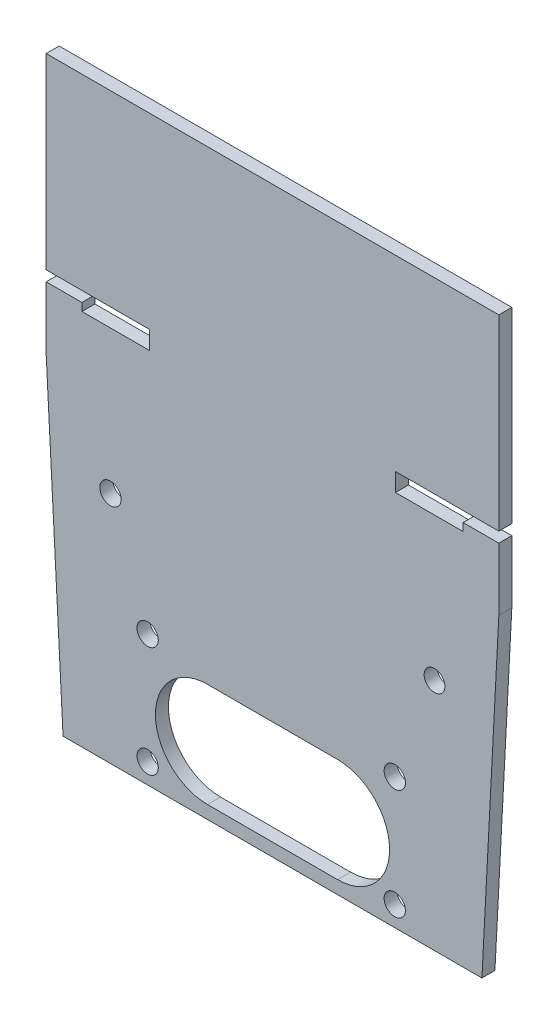
ISO-10303-21;
HEADER;
FILE_DESCRIPTION(('STEP AP214'),'2;1');
FILE_NAME('part.step','',(''),(''),'','','');
FILE_SCHEMA(('AUTOMOTIVE_DESIGN { 1 0 10303 214 1 1 1 1 }'));
ENDSEC;
DATA;
#1=APPLICATION_CONTEXT('core data for automotive mechanical design processes');
#2=APPLICATION_PROTOCOL_DEFINITION('international standard','automotive_design',2000,#1);
#3=PRODUCT_CONTEXT('',#1,'mechanical');
#4=PRODUCT('Part','Part','',(#3));
#5=PRODUCT_RELATED_PRODUCT_CATEGORY('part','',(#4));
#6=PRODUCT_DEFINITION_FORMATION('','',#4);
#7=PRODUCT_DEFINITION_CONTEXT('part definition',#1,'design');
#8=PRODUCT_DEFINITION('design','',#6,#7);
#9=PRODUCT_DEFINITION_SHAPE('','',#8);
#10=(LENGTH_UNIT() NAMED_UNIT(*) SI_UNIT(.MILLI.,.METRE.));
#11=(NAMED_UNIT(*) PLANE_ANGLE_UNIT() SI_UNIT($,.RADIAN.));
#12=(NAMED_UNIT(*) SI_UNIT($,.STERADIAN.) SOLID_ANGLE_UNIT());
#13=UNCERTAINTY_MEASURE_WITH_UNIT(LENGTH_MEASURE(1.E-05),#10,'distance_accuracy_value','');
#14=(GEOMETRIC_REPRESENTATION_CONTEXT(3) GLOBAL_UNCERTAINTY_ASSIGNED_CONTEXT((#13)) GLOBAL_UNIT_ASSIGNED_CONTEXT((#10,
#11,#12)) REPRESENTATION_CONTEXT('',''));
#15=CARTESIAN_POINT('',(0.,0.,0.));
#16=DIRECTION('',(0.,0.,1.));
#17=DIRECTION('',(1.,0.,0.));
#18=AXIS2_PLACEMENT_3D('',#15,#16,#17);
#19=CARTESIAN_POINT('',(-47.2577867027928,0.,5.));
#20=DIRECTION('',(1.,0.,0.));
#21=DIRECTION('',(0.,1.,0.));
#22=AXIS2_PLACEMENT_3D('',#19,#20,#21);
#23=PLANE('',#22);
#24=DIRECTION('',(0.,0.,-1.));
#25=VECTOR('',#24,1.);
#26=CARTESIAN_POINT('',(-47.2577867027929,82.9999999999999,5.));
#27=LINE('',#26,#25);
#28=CARTESIAN_POINT('',(-47.2577867027929,82.9999999999999,5.));
#29=VERTEX_POINT('',#28);
#30=CARTESIAN_POINT('',(-47.2577867027929,82.9999999999999,0.));
#31=VERTEX_POINT('',#30);
#32=EDGE_CURVE('E265',#29,#31,#27,.T.);
#33=ORIENTED_EDGE('',*,*,#32,.F.);
#34=DIRECTION('',(0.,-1.,0.));
#35=VECTOR('',#34,1.);
#36=CARTESIAN_POINT('',(-47.2577867027928,0.,5.));
#37=LINE('',#36,#35);
#38=CARTESIAN_POINT('',(-47.2577867027929,90.,5.));
#39=VERTEX_POINT('',#38);
#40=EDGE_CURVE('E188',#39,#29,#37,.T.);
#41=ORIENTED_EDGE('',*,*,#40,.F.);
#42=DIRECTION('',(0.,0.,-1.));
#43=VECTOR('',#42,1.);
#44=CARTESIAN_POINT('',(-47.2577867027929,90.,5.));
#45=LINE('',#44,#43);
#46=CARTESIAN_POINT('',(-47.2577867027929,90.,0.));
#47=VERTEX_POINT('',#46);
#48=EDGE_CURVE('E267',#39,#47,#45,.T.);
#49=ORIENTED_EDGE('',*,*,#48,.T.);
#50=DIRECTION('',(0.,-1.,0.));
#51=VECTOR('',#50,1.);
#52=CARTESIAN_POINT('',(-47.2577867027928,0.,0.));
#53=LINE('',#52,#51);
#54=EDGE_CURVE('E253',#47,#31,#53,.T.);
#55=ORIENTED_EDGE('',*,*,#54,.T.);
#56=EDGE_LOOP('',(#33,#41,#49,#55));
#57=FACE_BOUND('',#56,.T.);
#58=ADVANCED_FACE('F37',(#57),#23,.F.);
#59=CARTESIAN_POINT('',(-73.2577867027929,0.,5.));
#60=DIRECTION('',(-1.,0.,0.));
#61=DIRECTION('',(0.,0.,1.));
#62=AXIS2_PLACEMENT_3D('',#59,#60,#61);
#63=PLANE('',#62);
#64=DIRECTION('',(0.,1.,0.));
#65=VECTOR('',#64,1.);
#66=CARTESIAN_POINT('',(-73.2577867027929,0.,5.));
#67=LINE('',#66,#65);
#68=CARTESIAN_POINT('',(-73.2577867027929,82.9999999999999,5.));
#69=VERTEX_POINT('',#68);
#70=CARTESIAN_POINT('',(-73.2577867027929,86.,5.));
#71=VERTEX_POINT('',#70);
#72=EDGE_CURVE('E175',#69,#71,#67,.T.);
#73=ORIENTED_EDGE('',*,*,#72,.F.);
#74=DIRECTION('',(0.,0.,-1.));
#75=VECTOR('',#74,1.);
#76=CARTESIAN_POINT('',(-73.2577867027929,82.9999999999999,5.));
#77=LINE('',#76,#75);
#78=CARTESIAN_POINT('',(-73.2577867027929,82.9999999999999,0.));
#79=VERTEX_POINT('',#78);
#80=EDGE_CURVE('E197',#69,#79,#77,.T.);
#81=ORIENTED_EDGE('',*,*,#80,.T.);
#82=DIRECTION('',(0.,1.,0.));
#83=VECTOR('',#82,1.);
#84=CARTESIAN_POINT('',(-73.2577867027929,0.,0.));
#85=LINE('',#84,#83);
#86=CARTESIAN_POINT('',(-73.2577867027929,86.,0.));
#87=VERTEX_POINT('',#86);
#88=EDGE_CURVE('E194',#79,#87,#85,.T.);
#89=ORIENTED_EDGE('',*,*,#88,.T.);
#90=DIRECTION('',(0.,0.,-1.));
#91=VECTOR('',#90,1.);
#92=CARTESIAN_POINT('',(-73.2577867027929,86.,5.));
#93=LINE('',#92,#91);
#94=EDGE_CURVE('E191',#71,#87,#93,.T.);
#95=ORIENTED_EDGE('',*,*,#94,.F.);
#96=EDGE_LOOP('',(#73,#81,#89,#95));
#97=FACE_BOUND('',#96,.T.);
#98=ADVANCED_FACE('F192',(#97),#63,.F.);
#99=CARTESIAN_POINT('',(-83.5213200872231,-4.37716690855885,5.));
#100=DIRECTION('',(0.998629534754574,0.052335956242937,0.));
#101=DIRECTION('',(-0.052335956242937,0.998629534754574,0.));
#102=AXIS2_PLACEMENT_3D('',#99,#100,#101);
#103=PLANE('',#102);
#104=DIRECTION('',(0.052335956242937,-0.998629534754574,0.));
#105=VECTOR('',#104,1.);
#106=CARTESIAN_POINT('',(-83.5213200872231,-4.37716690855885,0.));
#107=LINE('',#106,#105);
#108=CARTESIAN_POINT('',(-87.,62.,0.));
#109=VERTEX_POINT('',#108);
#110=CARTESIAN_POINT('',(-80.5014353689038,-62.,0.));
#111=VERTEX_POINT('',#110);
#112=EDGE_CURVE('E220',#109,#111,#107,.T.);
#113=ORIENTED_EDGE('',*,*,#112,.T.);
#114=DIRECTION('',(0.,0.,-1.));
#115=VECTOR('',#114,1.);
#116=CARTESIAN_POINT('',(-80.5014353689038,-62.,5.));
#117=LINE('',#116,#115);
#118=CARTESIAN_POINT('',(-80.5014353689038,-62.,5.));
#119=VERTEX_POINT('',#118);
#120=EDGE_CURVE('E11',#119,#111,#117,.T.);
#121=ORIENTED_EDGE('',*,*,#120,.F.);
#122=DIRECTION('',(0.052335956242937,-0.998629534754574,0.));
#123=VECTOR('',#122,1.);
#124=CARTESIAN_POINT('',(-83.5213200872231,-4.37716690855885,5.));
#125=LINE('',#124,#123);
#126=CARTESIAN_POINT('',(-87.,62.,5.));
#127=VERTEX_POINT('',#126);
#128=EDGE_CURVE('E322',#127,#119,#125,.T.);
#129=ORIENTED_EDGE('',*,*,#128,.F.);
#130=DIRECTION('',(0.,0.,-1.));
#131=VECTOR('',#130,1.);
#132=CARTESIAN_POINT('',(-87.,62.,5.));
#133=LINE('',#132,#131);
#134=EDGE_CURVE('E56',#127,#109,#133,.T.);
#135=ORIENTED_EDGE('',*,*,#134,.T.);
#136=EDGE_LOOP('',(#113,#121,#129,#135));
#137=FACE_BOUND('',#136,.T.);
#138=ADVANCED_FACE('F458',(#137),#103,.F.);
#139=CARTESIAN_POINT('',(0.,-62.,5.));
#140=DIRECTION('',(0.,1.,0.));
#141=DIRECTION('',(-1.,0.,0.));
#142=AXIS2_PLACEMENT_3D('',#139,#140,#141);
#143=PLANE('',#142);
#144=DIRECTION('',(1.,0.,0.));
#145=VECTOR('',#144,1.);
#146=CARTESIAN_POINT('',(0.,-62.,0.));
#147=LINE('',#146,#145);
#148=CARTESIAN_POINT('',(80.5014353689037,-62.,0.));
#149=VERTEX_POINT('',#148);
#150=EDGE_CURVE('E222',#111,#149,#147,.T.);
#151=ORIENTED_EDGE('',*,*,#150,.T.);
#152=DIRECTION('',(0.,0.,-1.));
#153=VECTOR('',#152,1.);
#154=CARTESIAN_POINT('',(80.5014353689037,-62.,5.));
#155=LINE('',#154,#153);
#156=CARTESIAN_POINT('',(80.5014353689037,-62.,5.));
#157=VERTEX_POINT('',#156);
#158=EDGE_CURVE('E47',#157,#149,#155,.T.);
#159=ORIENTED_EDGE('',*,*,#158,.F.);
#160=DIRECTION('',(1.,0.,0.));
#161=VECTOR('',#160,1.);
#162=CARTESIAN_POINT('',(0.,-62.,5.));
#163=LINE('',#162,#161);
#164=EDGE_CURVE('E325',#119,#157,#163,.T.);
#165=ORIENTED_EDGE('',*,*,#164,.F.);
#166=ORIENTED_EDGE('',*,*,#120,.T.);
#167=EDGE_LOOP('',(#151,#159,#165,#166));
#168=FACE_BOUND('',#167,.T.);
#169=ADVANCED_FACE('F493',(#168),#143,.F.);
#170=CARTESIAN_POINT('',(83.5213200872231,-4.37716690855885,5.));
#171=DIRECTION('',(0.998629534754574,-0.052335956242937,0.));
#172=DIRECTION('',(0.052335956242937,0.998629534754574,0.));
#173=AXIS2_PLACEMENT_3D('',#170,#171,#172);
#174=PLANE('',#173);
#175=DIRECTION('',(-0.052335956242937,-0.998629534754574,0.));
#176=VECTOR('',#175,1.);
#177=CARTESIAN_POINT('',(83.5213200872231,-4.37716690855885,0.));
#178=LINE('',#177,#176);
#179=CARTESIAN_POINT('',(87.,62.,0.));
#180=VERTEX_POINT('',#179);
#181=EDGE_CURVE('E225',#180,#149,#178,.T.);
#182=ORIENTED_EDGE('',*,*,#181,.F.);
#183=DIRECTION('',(0.,0.,-1.));
#184=VECTOR('',#183,1.);
#185=CARTESIAN_POINT('',(87.,62.,5.));
#186=LINE('',#185,#184);
#187=CARTESIAN_POINT('',(87.,62.,5.));
#188=VERTEX_POINT('',#187);
#189=EDGE_CURVE('E284',#188,#180,#186,.T.);
#190=ORIENTED_EDGE('',*,*,#189,.F.);
#191=DIRECTION('',(-0.052335956242937,-0.998629534754574,0.));
#192=VECTOR('',#191,1.);
#193=CARTESIAN_POINT('',(83.5213200872231,-4.37716690855885,5.));
#194=LINE('',#193,#192);
#195=EDGE_CURVE('E327',#188,#157,#194,.T.);
#196=ORIENTED_EDGE('',*,*,#195,.T.);
#197=ORIENTED_EDGE('',*,*,#158,.T.);
#198=EDGE_LOOP('',(#182,#190,#196,#197));
#199=FACE_BOUND('',#198,.T.);
#200=ADVANCED_FACE('F490',(#199),#174,.T.);
#201=CARTESIAN_POINT('',(87.,0.,5.));
#202=DIRECTION('',(1.,0.,0.));
#203=DIRECTION('',(0.,0.,-1.));
#204=AXIS2_PLACEMENT_3D('',#201,#202,#203);
#205=PLANE('',#204);
#206=DIRECTION('',(0.,-1.,0.));
#207=VECTOR('',#206,1.);
#208=CARTESIAN_POINT('',(87.,0.,0.));
#209=LINE('',#208,#207);
#210=CARTESIAN_POINT('',(87.,86.,0.));
#211=VERTEX_POINT('',#210);
#212=EDGE_CURVE('E228',#211,#180,#209,.T.);
#213=ORIENTED_EDGE('',*,*,#212,.F.);
#214=DIRECTION('',(0.,0.,-1.));
#215=VECTOR('',#214,1.);
#216=CARTESIAN_POINT('',(87.,86.,5.));
#217=LINE('',#216,#215);
#218=CARTESIAN_POINT('',(87.,86.,5.));
#219=VERTEX_POINT('',#218);
#220=EDGE_CURVE('E282',#219,#211,#217,.T.);
#221=ORIENTED_EDGE('',*,*,#220,.F.);
#222=DIRECTION('',(0.,-1.,0.));
#223=VECTOR('',#222,1.);
#224=CARTESIAN_POINT('',(87.,0.,5.));
#225=LINE('',#224,#223);
#226=EDGE_CURVE('E330',#219,#188,#225,.T.);
#227=ORIENTED_EDGE('',*,*,#226,.T.);
#228=ORIENTED_EDGE('',*,*,#189,.T.);
#229=EDGE_LOOP('',(#213,#221,#227,#228));
#230=FACE_BOUND('',#229,.T.);
#231=ADVANCED_FACE('F470',(#230),#205,.T.);
#232=CARTESIAN_POINT('',(0.,86.,5.));
#233=DIRECTION('',(0.,1.,0.));
#234=DIRECTION('',(0.,0.,1.));
#235=AXIS2_PLACEMENT_3D('',#232,#233,#234);
#236=PLANE('',#235);
#237=DIRECTION('',(1.,0.,0.));
#238=VECTOR('',#237,1.);
#239=CARTESIAN_POINT('',(0.,86.,0.));
#240=LINE('',#239,#238);
#241=CARTESIAN_POINT('',(73.2577867027928,86.,0.));
#242=VERTEX_POINT('',#241);
#243=EDGE_CURVE('E231',#242,#211,#240,.T.);
#244=ORIENTED_EDGE('',*,*,#243,.F.);
#245=DIRECTION('',(0.,0.,-1.));
#246=VECTOR('',#245,1.);
#247=CARTESIAN_POINT('',(73.2577867027928,86.,5.));
#248=LINE('',#247,#246);
#249=CARTESIAN_POINT('',(73.2577867027928,86.,5.));
#250=VERTEX_POINT('',#249);
#251=EDGE_CURVE('E280',#250,#242,#248,.T.);
#252=ORIENTED_EDGE('',*,*,#251,.F.);
#253=DIRECTION('',(1.,0.,0.));
#254=VECTOR('',#253,1.);
#255=CARTESIAN_POINT('',(0.,86.,5.));
#256=LINE('',#255,#254);
#257=EDGE_CURVE('E333',#250,#219,#256,.T.);
#258=ORIENTED_EDGE('',*,*,#257,.T.);
#259=ORIENTED_EDGE('',*,*,#220,.T.);
#260=EDGE_LOOP('',(#244,#252,#258,#259));
#261=FACE_BOUND('',#260,.T.);
#262=ADVANCED_FACE('F485',(#261),#236,.T.);
#263=CARTESIAN_POINT('',(73.2577867027928,0.,5.));
#264=DIRECTION('',(-1.,0.,0.));
#265=DIRECTION('',(0.,0.,1.));
#266=AXIS2_PLACEMENT_3D('',#263,#264,#265);
#267=PLANE('',#266);
#268=DIRECTION('',(0.,0.,-1.));
#269=VECTOR('',#268,1.);
#270=CARTESIAN_POINT('',(73.2577867027928,83.,5.));
#271=LINE('',#270,#269);
#272=CARTESIAN_POINT('',(73.2577867027928,83.,5.));
#273=VERTEX_POINT('',#272);
#274=CARTESIAN_POINT('',(73.2577867027928,83.,0.));
#275=VERTEX_POINT('',#274);
#276=EDGE_CURVE('E278',#273,#275,#271,.T.);
#277=ORIENTED_EDGE('',*,*,#276,.F.);
#278=DIRECTION('',(0.,1.,0.));
#279=VECTOR('',#278,1.);
#280=CARTESIAN_POINT('',(73.2577867027928,0.,5.));
#281=LINE('',#280,#279);
#282=EDGE_CURVE('E337',#273,#250,#281,.T.);
#283=ORIENTED_EDGE('',*,*,#282,.T.);
#284=ORIENTED_EDGE('',*,*,#251,.T.);
#285=DIRECTION('',(0.,1.,0.));
#286=VECTOR('',#285,1.);
#287=CARTESIAN_POINT('',(73.2577867027928,0.,0.));
#288=LINE('',#287,#286);
#289=EDGE_CURVE('E235',#275,#242,#288,.T.);
#290=ORIENTED_EDGE('',*,*,#289,.F.);
#291=EDGE_LOOP('',(#277,#283,#284,#290));
#292=FACE_BOUND('',#291,.T.);
#293=ADVANCED_FACE('F481',(#292),#267,.T.);
#294=CARTESIAN_POINT('',(0.,83.,5.));
#295=DIRECTION('',(0.,1.,0.));
#296=DIRECTION('',(0.,0.,1.));
#297=AXIS2_PLACEMENT_3D('',#294,#295,#296);
#298=PLANE('',#297);
#299=DIRECTION('',(0.,0.,-1.));
#300=VECTOR('',#299,1.);
#301=CARTESIAN_POINT('',(47.2577867027928,83.,5.));
#302=LINE('',#301,#300);
#303=CARTESIAN_POINT('',(47.2577867027928,83.,5.));
#304=VERTEX_POINT('',#303);
#305=CARTESIAN_POINT('',(47.2577867027928,83.,0.));
#306=VERTEX_POINT('',#305);
#307=EDGE_CURVE('E276',#304,#306,#302,.T.);
#308=ORIENTED_EDGE('',*,*,#307,.F.);
#309=DIRECTION('',(1.,0.,0.));
#310=VECTOR('',#309,1.);
#311=CARTESIAN_POINT('',(0.,83.,5.));
#312=LINE('',#311,#310);
#313=EDGE_CURVE('E211',#304,#273,#312,.T.);
#314=ORIENTED_EDGE('',*,*,#313,.T.);
#315=ORIENTED_EDGE('',*,*,#276,.T.);
#316=DIRECTION('',(1.,0.,0.));
#317=VECTOR('',#316,1.);
#318=CARTESIAN_POINT('',(0.,83.,0.));
#319=LINE('',#318,#317);
#320=EDGE_CURVE('E238',#306,#275,#319,.T.);
#321=ORIENTED_EDGE('',*,*,#320,.F.);
#322=EDGE_LOOP('',(#308,#314,#315,#321));
#323=FACE_BOUND('',#322,.T.);
#324=ADVANCED_FACE('F477',(#323),#298,.T.);
#325=CARTESIAN_POINT('',(47.2577867027929,0.,5.));
#326=DIRECTION('',(1.,0.,0.));
#327=DIRECTION('',(0.,1.,0.));
#328=AXIS2_PLACEMENT_3D('',#325,#326,#327);
#329=PLANE('',#328);
#330=DIRECTION('',(0.,-1.,0.));
#331=VECTOR('',#330,1.);
#332=CARTESIAN_POINT('',(47.2577867027929,0.,5.));
#333=LINE('',#332,#331);
#334=CARTESIAN_POINT('',(47.2577867027928,90.,5.));
#335=VERTEX_POINT('',#334);
#336=EDGE_CURVE('E339',#335,#304,#333,.T.);
#337=ORIENTED_EDGE('',*,*,#336,.T.);
#338=ORIENTED_EDGE('',*,*,#307,.T.);
#339=DIRECTION('',(0.,-1.,0.));
#340=VECTOR('',#339,1.);
#341=CARTESIAN_POINT('',(47.2577867027929,0.,0.));
#342=LINE('',#341,#340);
#343=CARTESIAN_POINT('',(47.2577867027928,90.,0.));
#344=VERTEX_POINT('',#343);
#345=EDGE_CURVE('E241',#344,#306,#342,.T.);
#346=ORIENTED_EDGE('',*,*,#345,.F.);
#347=DIRECTION('',(0.,0.,-1.));
#348=VECTOR('',#347,1.);
#349=CARTESIAN_POINT('',(47.2577867027928,90.,5.));
#350=LINE('',#349,#348);
#351=EDGE_CURVE('E274',#335,#344,#350,.T.);
#352=ORIENTED_EDGE('',*,*,#351,.F.);
#353=EDGE_LOOP('',(#337,#338,#346,#352));
#354=FACE_BOUND('',#353,.T.);
#355=ADVANCED_FACE('F473',(#354),#329,.T.);
#356=CARTESIAN_POINT('',(0.,89.9999999999999,5.));
#357=DIRECTION('',(0.,-1.,0.));
#358=DIRECTION('',(1.,0.,0.));
#359=AXIS2_PLACEMENT_3D('',#356,#357,#358);
#360=PLANE('',#359);
#361=DIRECTION('',(-1.,0.,0.));
#362=VECTOR('',#361,1.);
#363=CARTESIAN_POINT('',(0.,89.9999999999999,0.));
#364=LINE('',#363,#362);
#365=CARTESIAN_POINT('',(87.,90.,0.));
#366=VERTEX_POINT('',#365);
#367=EDGE_CURVE('E244',#366,#344,#364,.T.);
#368=ORIENTED_EDGE('',*,*,#367,.F.);
#369=DIRECTION('',(0.,0.,-1.));
#370=VECTOR('',#369,1.);
#371=CARTESIAN_POINT('',(87.,90.,5.));
#372=LINE('',#371,#370);
#373=CARTESIAN_POINT('',(87.,90.,5.));
#374=VERTEX_POINT('',#373);
#375=EDGE_CURVE('E272',#374,#366,#372,.T.);
#376=ORIENTED_EDGE('',*,*,#375,.F.);
#377=DIRECTION('',(-1.,0.,0.));
#378=VECTOR('',#377,1.);
#379=CARTESIAN_POINT('',(0.,89.9999999999999,5.));
#380=LINE('',#379,#378);
#381=EDGE_CURVE('E342',#374,#335,#380,.T.);
#382=ORIENTED_EDGE('',*,*,#381,.T.);
#383=ORIENTED_EDGE('',*,*,#351,.T.);
#384=EDGE_LOOP('',(#368,#376,#382,#383));
#385=FACE_BOUND('',#384,.T.);
#386=ADVANCED_FACE('F469',(#385),#360,.T.);
#387=CARTESIAN_POINT('',(87.,162.,0.));
#388=VERTEX_POINT('',#387);
#389=EDGE_CURVE('E232',#388,#366,#209,.T.);
#390=ORIENTED_EDGE('',*,*,#389,.F.);
#391=DIRECTION('',(0.,0.,-1.));
#392=VECTOR('',#391,1.);
#393=CARTESIAN_POINT('',(87.,162.,5.));
#394=LINE('',#393,#392);
#395=CARTESIAN_POINT('',(87.,162.,5.));
#396=VERTEX_POINT('',#395);
#397=EDGE_CURVE('E380',#396,#388,#394,.T.);
#398=ORIENTED_EDGE('',*,*,#397,.F.);
#399=EDGE_CURVE('E334',#396,#374,#225,.T.);
#400=ORIENTED_EDGE('',*,*,#399,.T.);
#401=ORIENTED_EDGE('',*,*,#375,.T.);
#402=EDGE_LOOP('',(#390,#398,#400,#401));
#403=FACE_BOUND('',#402,.T.);
#404=ADVANCED_FACE('F377',(#403),#205,.T.);
#405=CARTESIAN_POINT('',(-87.,0.,5.));
#406=DIRECTION('',(-1.,0.,0.));
#407=DIRECTION('',(0.,0.,1.));
#408=AXIS2_PLACEMENT_3D('',#405,#406,#407);
#409=PLANE('',#408);
#410=DIRECTION('',(0.,1.,0.));
#411=VECTOR('',#410,1.);
#412=CARTESIAN_POINT('',(-87.,0.,0.));
#413=LINE('',#412,#411);
#414=CARTESIAN_POINT('',(-87.,90.,0.));
#415=VERTEX_POINT('',#414);
#416=CARTESIAN_POINT('',(-87.,162.,0.));
#417=VERTEX_POINT('',#416);
#418=EDGE_CURVE('E247',#415,#417,#413,.T.);
#419=ORIENTED_EDGE('',*,*,#418,.F.);
#420=DIRECTION('',(0.,0.,-1.));
#421=VECTOR('',#420,1.);
#422=CARTESIAN_POINT('',(-87.,90.,5.));
#423=LINE('',#422,#421);
#424=CARTESIAN_POINT('',(-87.,90.,5.));
#425=VERTEX_POINT('',#424);
#426=EDGE_CURVE('E270',#425,#415,#423,.T.);
#427=ORIENTED_EDGE('',*,*,#426,.F.);
#428=DIRECTION('',(0.,1.,0.));
#429=VECTOR('',#428,1.);
#430=CARTESIAN_POINT('',(-87.,0.,5.));
#431=LINE('',#430,#429);
#432=CARTESIAN_POINT('',(-87.,162.,5.));
#433=VERTEX_POINT('',#432);
#434=EDGE_CURVE('E204',#425,#433,#431,.T.);
#435=ORIENTED_EDGE('',*,*,#434,.T.);
#436=DIRECTION('',(0.,0.,1.));
#437=VECTOR('',#436,1.);
#438=CARTESIAN_POINT('',(-87.,162.,0.));
#439=LINE('',#438,#437);
#440=EDGE_CURVE('E391',#417,#433,#439,.T.);
#441=ORIENTED_EDGE('',*,*,#440,.F.);
#442=EDGE_LOOP('',(#419,#427,#435,#441));
#443=FACE_BOUND('',#442,.T.);
#444=ADVANCED_FACE('F465',(#443),#409,.T.);
#445=CARTESIAN_POINT('',(0.,89.9999999999999,5.));
#446=DIRECTION('',(0.,1.,0.));
#447=DIRECTION('',(-1.,0.,0.));
#448=AXIS2_PLACEMENT_3D('',#445,#446,#447);
#449=PLANE('',#448);
#450=DIRECTION('',(1.,0.,0.));
#451=VECTOR('',#450,1.);
#452=CARTESIAN_POINT('',(0.,89.9999999999999,0.));
#453=LINE('',#452,#451);
#454=EDGE_CURVE('E250',#415,#47,#453,.T.);
#455=ORIENTED_EDGE('',*,*,#454,.T.);
#456=ORIENTED_EDGE('',*,*,#48,.F.);
#457=DIRECTION('',(1.,0.,0.));
#458=VECTOR('',#457,1.);
#459=CARTESIAN_POINT('',(0.,89.9999999999999,5.));
#460=LINE('',#459,#458);
#461=EDGE_CURVE('E346',#425,#39,#460,.T.);
#462=ORIENTED_EDGE('',*,*,#461,.F.);
#463=ORIENTED_EDGE('',*,*,#426,.T.);
#464=EDGE_LOOP('',(#455,#456,#462,#463));
#465=FACE_BOUND('',#464,.T.);
#466=ADVANCED_FACE('F462',(#465),#449,.F.);
#467=CARTESIAN_POINT('',(0.,82.9999999999999,5.));
#468=DIRECTION('',(0.,-1.,0.));
#469=DIRECTION('',(0.,0.,-1.));
#470=AXIS2_PLACEMENT_3D('',#467,#468,#469);
#471=PLANE('',#470);
#472=ORIENTED_EDGE('',*,*,#80,.F.);
#473=DIRECTION('',(-1.,0.,0.));
#474=VECTOR('',#473,1.);
#475=CARTESIAN_POINT('',(0.,82.9999999999999,5.));
#476=LINE('',#475,#474);
#477=EDGE_CURVE('E186',#29,#69,#476,.T.);
#478=ORIENTED_EDGE('',*,*,#477,.F.);
#479=ORIENTED_EDGE('',*,*,#32,.T.);
#480=DIRECTION('',(-1.,0.,0.));
#481=VECTOR('',#480,1.);
#482=CARTESIAN_POINT('',(0.,82.9999999999999,0.));
#483=LINE('',#482,#481);
#484=EDGE_CURVE('E256',#31,#79,#483,.T.);
#485=ORIENTED_EDGE('',*,*,#484,.T.);
#486=EDGE_LOOP('',(#472,#478,#479,#485));
#487=FACE_BOUND('',#486,.T.);
#488=ADVANCED_FACE('F360',(#487),#471,.F.);
#489=CARTESIAN_POINT('',(0.,86.,5.));
#490=DIRECTION('',(0.,-1.,0.));
#491=DIRECTION('',(1.,0.,0.));
#492=AXIS2_PLACEMENT_3D('',#489,#490,#491);
#493=PLANE('',#492);
#494=DIRECTION('',(-1.,0.,0.));
#495=VECTOR('',#494,1.);
#496=CARTESIAN_POINT('',(0.,86.,0.));
#497=LINE('',#496,#495);
#498=CARTESIAN_POINT('',(-87.,85.9999999999999,0.));
#499=VERTEX_POINT('',#498);
#500=EDGE_CURVE('E260',#87,#499,#497,.T.);
#501=ORIENTED_EDGE('',*,*,#500,.T.);
#502=DIRECTION('',(0.,0.,-1.));
#503=VECTOR('',#502,1.);
#504=CARTESIAN_POINT('',(-87.,85.9999999999999,5.));
#505=LINE('',#504,#503);
#506=CARTESIAN_POINT('',(-87.,85.9999999999999,5.));
#507=VERTEX_POINT('',#506);
#508=EDGE_CURVE('E120',#507,#499,#505,.T.);
#509=ORIENTED_EDGE('',*,*,#508,.F.);
#510=DIRECTION('',(-1.,0.,0.));
#511=VECTOR('',#510,1.);
#512=CARTESIAN_POINT('',(0.,86.,5.));
#513=LINE('',#512,#511);
#514=EDGE_CURVE('E182',#71,#507,#513,.T.);
#515=ORIENTED_EDGE('',*,*,#514,.F.);
#516=ORIENTED_EDGE('',*,*,#94,.T.);
#517=EDGE_LOOP('',(#501,#509,#515,#516));
#518=FACE_BOUND('',#517,.T.);
#519=ADVANCED_FACE('F199',(#518),#493,.F.);
#520=CARTESIAN_POINT('',(25.,-37.,5.));
#521=DIRECTION('',(0.,0.,-1.));
#522=DIRECTION('',(-1.,0.,0.));
#523=AXIS2_PLACEMENT_3D('',#520,#521,#522);
#524=CYLINDRICAL_SURFACE('',#523,20.);
#525=CARTESIAN_POINT('',(25.,-37.,0.));
#526=DIRECTION('',(0.,0.,1.));
#527=DIRECTION('',(1.,0.,0.));
#528=AXIS2_PLACEMENT_3D('',#525,#526,#527);
#529=CIRCLE('',#528,20.);
#530=CARTESIAN_POINT('',(25.,-57.,0.));
#531=VERTEX_POINT('',#530);
#532=CARTESIAN_POINT('',(25.,-17.,0.));
#533=VERTEX_POINT('',#532);
#534=EDGE_CURVE('E207',#531,#533,#529,.T.);
#535=ORIENTED_EDGE('',*,*,#534,.F.);
#536=DIRECTION('',(0.,0.,-1.));
#537=VECTOR('',#536,1.);
#538=CARTESIAN_POINT('',(25.,-57.,5.));
#539=LINE('',#538,#537);
#540=CARTESIAN_POINT('',(25.,-57.,5.));
#541=VERTEX_POINT('',#540);
#542=EDGE_CURVE('E132',#541,#531,#539,.T.);
#543=ORIENTED_EDGE('',*,*,#542,.F.);
#544=CARTESIAN_POINT('',(25.,-37.,5.));
#545=DIRECTION('',(0.,0.,1.));
#546=DIRECTION('',(1.,0.,0.));
#547=AXIS2_PLACEMENT_3D('',#544,#545,#546);
#548=CIRCLE('',#547,20.);
#549=CARTESIAN_POINT('',(25.,-17.,5.));
#550=VERTEX_POINT('',#549);
#551=EDGE_CURVE('E312',#541,#550,#548,.T.);
#552=ORIENTED_EDGE('',*,*,#551,.T.);
#553=DIRECTION('',(0.,0.,-1.));
#554=VECTOR('',#553,1.);
#555=CARTESIAN_POINT('',(25.,-17.,5.));
#556=LINE('',#555,#554);
#557=EDGE_CURVE('E202',#550,#533,#556,.T.);
#558=ORIENTED_EDGE('',*,*,#557,.T.);
#559=EDGE_LOOP('',(#535,#543,#552,#558));
#560=FACE_BOUND('',#559,.T.);
#561=ADVANCED_FACE('F39',(#560),#524,.F.);
#562=CARTESIAN_POINT('',(0.,-57.,5.));
#563=DIRECTION('',(0.,1.,0.));
#564=DIRECTION('',(0.,0.,1.));
#565=AXIS2_PLACEMENT_3D('',#562,#563,#564);
#566=PLANE('',#565);
#567=DIRECTION('',(1.,0.,0.));
#568=VECTOR('',#567,1.);
#569=CARTESIAN_POINT('',(0.,-57.,0.));
#570=LINE('',#569,#568);
#571=CARTESIAN_POINT('',(-25.,-57.,0.));
#572=VERTEX_POINT('',#571);
#573=EDGE_CURVE('E210',#572,#531,#570,.T.);
#574=ORIENTED_EDGE('',*,*,#573,.F.);
#575=DIRECTION('',(0.,0.,-1.));
#576=VECTOR('',#575,1.);
#577=CARTESIAN_POINT('',(-25.,-57.,5.));
#578=LINE('',#577,#576);
#579=CARTESIAN_POINT('',(-25.,-57.,5.));
#580=VERTEX_POINT('',#579);
#581=EDGE_CURVE('E290',#580,#572,#578,.T.);
#582=ORIENTED_EDGE('',*,*,#581,.F.);
#583=DIRECTION('',(1.,0.,0.));
#584=VECTOR('',#583,1.);
#585=CARTESIAN_POINT('',(0.,-57.,5.));
#586=LINE('',#585,#584);
#587=EDGE_CURVE('E314',#580,#541,#586,.T.);
#588=ORIENTED_EDGE('',*,*,#587,.T.);
#589=ORIENTED_EDGE('',*,*,#542,.T.);
#590=EDGE_LOOP('',(#574,#582,#588,#589));
#591=FACE_BOUND('',#590,.T.);
#592=ADVANCED_FACE('F506',(#591),#566,.T.);
#593=CARTESIAN_POINT('',(-25.,-37.,5.));
#594=DIRECTION('',(0.,0.,-1.));
#595=DIRECTION('',(-1.,0.,0.));
#596=AXIS2_PLACEMENT_3D('',#593,#594,#595);
#597=CYLINDRICAL_SURFACE('',#596,20.);
#598=CARTESIAN_POINT('',(-25.,-37.,0.));
#599=DIRECTION('',(0.,0.,1.));
#600=DIRECTION('',(1.,0.,0.));
#601=AXIS2_PLACEMENT_3D('',#598,#599,#600);
#602=CIRCLE('',#601,20.);
#603=CARTESIAN_POINT('',(-25.,-17.,0.));
#604=VERTEX_POINT('',#603);
#605=EDGE_CURVE('E214',#604,#572,#602,.T.);
#606=ORIENTED_EDGE('',*,*,#605,.F.);
#607=DIRECTION('',(0.,0.,-1.));
#608=VECTOR('',#607,1.);
#609=CARTESIAN_POINT('',(-25.,-17.,5.));
#610=LINE('',#609,#608);
#611=CARTESIAN_POINT('',(-25.,-17.,5.));
#612=VERTEX_POINT('',#611);
#613=EDGE_CURVE('E288',#612,#604,#610,.T.);
#614=ORIENTED_EDGE('',*,*,#613,.F.);
#615=CARTESIAN_POINT('',(-25.,-37.,5.));
#616=DIRECTION('',(0.,0.,1.));
#617=DIRECTION('',(1.,0.,0.));
#618=AXIS2_PLACEMENT_3D('',#615,#616,#617);
#619=CIRCLE('',#618,20.);
#620=EDGE_CURVE('E317',#612,#580,#619,.T.);
#621=ORIENTED_EDGE('',*,*,#620,.T.);
#622=ORIENTED_EDGE('',*,*,#581,.T.);
#623=EDGE_LOOP('',(#606,#614,#621,#622));
#624=FACE_BOUND('',#623,.T.);
#625=ADVANCED_FACE('F503',(#624),#597,.F.);
#626=CARTESIAN_POINT('',(0.,-17.,5.));
#627=DIRECTION('',(0.,1.,0.));
#628=DIRECTION('',(0.,0.,1.));
#629=AXIS2_PLACEMENT_3D('',#626,#627,#628);
#630=PLANE('',#629);
#631=DIRECTION('',(1.,0.,0.));
#632=VECTOR('',#631,1.);
#633=CARTESIAN_POINT('',(0.,-17.,0.));
#634=LINE('',#633,#632);
#635=EDGE_CURVE('E217',#604,#533,#634,.T.);
#636=ORIENTED_EDGE('',*,*,#635,.T.);
#637=ORIENTED_EDGE('',*,*,#557,.F.);
#638=DIRECTION('',(1.,0.,0.));
#639=VECTOR('',#638,1.);
#640=CARTESIAN_POINT('',(0.,-17.,5.));
#641=LINE('',#640,#639);
#642=EDGE_CURVE('E320',#612,#550,#641,.T.);
#643=ORIENTED_EDGE('',*,*,#642,.F.);
#644=ORIENTED_EDGE('',*,*,#613,.T.);
#645=EDGE_LOOP('',(#636,#637,#643,#644));
#646=FACE_BOUND('',#645,.T.);
#647=ADVANCED_FACE('F500',(#646),#630,.F.);
#648=EDGE_CURVE('E251',#109,#499,#413,.T.);
#649=ORIENTED_EDGE('',*,*,#648,.F.);
#650=ORIENTED_EDGE('',*,*,#134,.F.);
#651=EDGE_CURVE('E200',#127,#507,#431,.T.);
#652=ORIENTED_EDGE('',*,*,#651,.T.);
#653=ORIENTED_EDGE('',*,*,#508,.T.);
#654=EDGE_LOOP('',(#649,#650,#652,#653));
#655=FACE_BOUND('',#654,.T.);
#656=ADVANCED_FACE('F430',(#655),#409,.T.);
#657=CARTESIAN_POINT('',(0.,0.,5.));
#658=DIRECTION('',(0.,0.,1.));
#659=DIRECTION('',(1.,0.,0.));
#660=AXIS2_PLACEMENT_3D('',#657,#658,#659);
#661=PLANE('',#660);
#662=CARTESIAN_POINT('',(46.999683563371,-54.2493208444166,5.));
#663=DIRECTION('',(0.,0.,1.));
#664=DIRECTION('',(1.,0.,0.));
#665=AXIS2_PLACEMENT_3D('',#662,#663,#664);
#666=CIRCLE('',#665,4.1);
#667=CARTESIAN_POINT('',(51.099683563371,-54.2493208444166,5.));
#668=VERTEX_POINT('',#667);
#669=EDGE_CURVE('E304',#668,#668,#666,.T.);
#670=ORIENTED_EDGE('',*,*,#669,.F.);
#671=EDGE_LOOP('',(#670));
#672=FACE_BOUND('',#671,.T.);
#673=CARTESIAN_POINT('',(-47.9999961853022,-54.2496086733768,5.));
#674=DIRECTION('',(0.,0.,1.));
#675=DIRECTION('',(1.,0.,0.));
#676=AXIS2_PLACEMENT_3D('',#673,#674,#675);
#677=CIRCLE('',#676,4.1);
#678=CARTESIAN_POINT('',(-43.8999961853022,-54.2496086733768,5.));
#679=VERTEX_POINT('',#678);
#680=EDGE_CURVE('E418',#679,#679,#677,.T.);
#681=ORIENTED_EDGE('',*,*,#680,.F.);
#682=EDGE_LOOP('',(#681));
#683=FACE_BOUND('',#682,.T.);
#684=CARTESIAN_POINT('',(-47.9999091571132,-11.7501336754584,5.));
#685=DIRECTION('',(0.,0.,1.));
#686=DIRECTION('',(1.,0.,0.));
#687=AXIS2_PLACEMENT_3D('',#684,#685,#686);
#688=CIRCLE('',#687,4.1);
#689=CARTESIAN_POINT('',(-43.8999091571132,-11.7501336754584,5.));
#690=VERTEX_POINT('',#689);
#691=EDGE_CURVE('E416',#690,#690,#688,.T.);
#692=ORIENTED_EDGE('',*,*,#691,.F.);
#693=EDGE_LOOP('',(#692));
#694=FACE_BOUND('',#693,.T.);
#695=CARTESIAN_POINT('',(47.0013006357032,-11.7491894013852,5.));
#696=DIRECTION('',(0.,0.,1.));
#697=DIRECTION('',(1.,0.,0.));
#698=AXIS2_PLACEMENT_3D('',#695,#696,#697);
#699=CIRCLE('',#698,4.1);
#700=CARTESIAN_POINT('',(51.1013006357032,-11.7491894013852,5.));
#701=VERTEX_POINT('',#700);
#702=EDGE_CURVE('E413',#701,#701,#699,.T.);
#703=ORIENTED_EDGE('',*,*,#702,.F.);
#704=EDGE_LOOP('',(#703));
#705=FACE_BOUND('',#704,.T.);
#706=CARTESIAN_POINT('',(-62.2814957804224,27.9179961681365,5.));
#707=DIRECTION('',(0.,0.,1.));
#708=DIRECTION('',(-1.,0.,0.));
#709=AXIS2_PLACEMENT_3D('',#706,#707,#708);
#710=CIRCLE('',#709,4.09999999999999);
#711=CARTESIAN_POINT('',(-66.3814957804224,27.9179961681365,5.));
#712=VERTEX_POINT('',#711);
#713=EDGE_CURVE('E294',#712,#712,#710,.T.);
#714=ORIENTED_EDGE('',*,*,#713,.F.);
#715=EDGE_LOOP('',(#714));
#716=FACE_BOUND('',#715,.T.);
#717=CARTESIAN_POINT('',(62.2814957804224,27.9179961681366,5.));
#718=DIRECTION('',(0.,0.,1.));
#719=DIRECTION('',(1.,0.,0.));
#720=AXIS2_PLACEMENT_3D('',#717,#718,#719);
#721=CIRCLE('',#720,4.00000000000001);
#722=CARTESIAN_POINT('',(66.2814957804224,27.9179961681366,5.));
#723=VERTEX_POINT('',#722);
#724=EDGE_CURVE('E299',#723,#723,#721,.T.);
#725=ORIENTED_EDGE('',*,*,#724,.F.);
#726=EDGE_LOOP('',(#725));
#727=FACE_BOUND('',#726,.T.);
#728=ORIENTED_EDGE('',*,*,#282,.F.);
#729=ORIENTED_EDGE('',*,*,#313,.F.);
#730=ORIENTED_EDGE('',*,*,#336,.F.);
#731=ORIENTED_EDGE('',*,*,#381,.F.);
#732=ORIENTED_EDGE('',*,*,#399,.F.);
#733=DIRECTION('',(1.,0.,0.));
#734=VECTOR('',#733,1.);
#735=CARTESIAN_POINT('',(-87.,162.,5.));
#736=LINE('',#735,#734);
#737=EDGE_CURVE('E396',#433,#396,#736,.T.);
#738=ORIENTED_EDGE('',*,*,#737,.F.);
#739=ORIENTED_EDGE('',*,*,#434,.F.);
#740=ORIENTED_EDGE('',*,*,#461,.T.);
#741=ORIENTED_EDGE('',*,*,#40,.T.);
#742=ORIENTED_EDGE('',*,*,#477,.T.);
#743=ORIENTED_EDGE('',*,*,#72,.T.);
#744=ORIENTED_EDGE('',*,*,#514,.T.);
#745=ORIENTED_EDGE('',*,*,#651,.F.);
#746=ORIENTED_EDGE('',*,*,#128,.T.);
#747=ORIENTED_EDGE('',*,*,#164,.T.);
#748=ORIENTED_EDGE('',*,*,#195,.F.);
#749=ORIENTED_EDGE('',*,*,#226,.F.);
#750=ORIENTED_EDGE('',*,*,#257,.F.);
#751=EDGE_LOOP('',(#728,#729,#730,#731,#732,#738,#739,#740,#741,#742,#743,#744,#745,#746,#747,
#748,#749,#750));
#752=FACE_BOUND('',#751,.T.);
#753=ORIENTED_EDGE('',*,*,#551,.F.);
#754=ORIENTED_EDGE('',*,*,#587,.F.);
#755=ORIENTED_EDGE('',*,*,#620,.F.);
#756=ORIENTED_EDGE('',*,*,#642,.T.);
#757=EDGE_LOOP('',(#753,#754,#755,#756));
#758=FACE_BOUND('',#757,.T.);
#759=ADVANCED_FACE('F178',(#672,#683,#694,#705,#716,#727,#752,#758),#661,.T.);
#760=CARTESIAN_POINT('',(0.,0.,0.));
#761=DIRECTION('',(0.,0.,1.));
#762=DIRECTION('',(1.,0.,0.));
#763=AXIS2_PLACEMENT_3D('',#760,#761,#762);
#764=PLANE('',#763);
#765=CARTESIAN_POINT('',(46.999683563371,-54.2493208444166,0.));
#766=DIRECTION('',(0.,0.,-1.));
#767=DIRECTION('',(-1.,0.,0.));
#768=AXIS2_PLACEMENT_3D('',#765,#766,#767);
#769=CIRCLE('',#768,4.1);
#770=CARTESIAN_POINT('',(42.899683563371,-54.2493208444166,0.));
#771=VERTEX_POINT('',#770);
#772=EDGE_CURVE('E401',#771,#771,#769,.T.);
#773=ORIENTED_EDGE('',*,*,#772,.F.);
#774=EDGE_LOOP('',(#773));
#775=FACE_BOUND('',#774,.T.);
#776=CARTESIAN_POINT('',(-47.9999961853022,-54.2496086733768,0.));
#777=DIRECTION('',(0.,0.,-1.));
#778=DIRECTION('',(-1.,0.,0.));
#779=AXIS2_PLACEMENT_3D('',#776,#777,#778);
#780=CIRCLE('',#779,4.1);
#781=CARTESIAN_POINT('',(-52.0999961853022,-54.2496086733768,0.));
#782=VERTEX_POINT('',#781);
#783=EDGE_CURVE('E406',#782,#782,#780,.T.);
#784=ORIENTED_EDGE('',*,*,#783,.F.);
#785=EDGE_LOOP('',(#784));
#786=FACE_BOUND('',#785,.T.);
#787=CARTESIAN_POINT('',(-47.9999091571132,-11.7501336754584,0.));
#788=DIRECTION('',(0.,0.,-1.));
#789=DIRECTION('',(-1.,0.,0.));
#790=AXIS2_PLACEMENT_3D('',#787,#788,#789);
#791=CIRCLE('',#790,4.1);
#792=CARTESIAN_POINT('',(-52.0999091571132,-11.7501336754584,0.));
#793=VERTEX_POINT('',#792);
#794=EDGE_CURVE('E402',#793,#793,#791,.T.);
#795=ORIENTED_EDGE('',*,*,#794,.F.);
#796=EDGE_LOOP('',(#795));
#797=FACE_BOUND('',#796,.T.);
#798=CARTESIAN_POINT('',(47.0013006357032,-11.7491894013852,0.));
#799=DIRECTION('',(0.,0.,-1.));
#800=DIRECTION('',(-1.,0.,0.));
#801=AXIS2_PLACEMENT_3D('',#798,#799,#800);
#802=CIRCLE('',#801,4.1);
#803=CARTESIAN_POINT('',(42.9013006357032,-11.7491894013852,0.));
#804=VERTEX_POINT('',#803);
#805=EDGE_CURVE('E405',#804,#804,#802,.T.);
#806=ORIENTED_EDGE('',*,*,#805,.F.);
#807=EDGE_LOOP('',(#806));
#808=FACE_BOUND('',#807,.T.);
#809=CARTESIAN_POINT('',(-62.2814957804224,27.9179961681365,0.));
#810=DIRECTION('',(0.,0.,1.));
#811=DIRECTION('',(1.,0.,0.));
#812=AXIS2_PLACEMENT_3D('',#809,#810,#811);
#813=CIRCLE('',#812,4.09999999999999);
#814=CARTESIAN_POINT('',(-58.1814957804224,27.9179961681365,0.));
#815=VERTEX_POINT('',#814);
#816=EDGE_CURVE('E41',#815,#815,#813,.T.);
#817=ORIENTED_EDGE('',*,*,#816,.T.);
#818=EDGE_LOOP('',(#817));
#819=FACE_BOUND('',#818,.T.);
#820=CARTESIAN_POINT('',(62.2814957804224,27.9179961681366,0.));
#821=DIRECTION('',(0.,0.,1.));
#822=DIRECTION('',(1.,0.,0.));
#823=AXIS2_PLACEMENT_3D('',#820,#821,#822);
#824=CIRCLE('',#823,4.00000000000001);
#825=CARTESIAN_POINT('',(66.2814957804224,27.9179961681366,0.));
#826=VERTEX_POINT('',#825);
#827=EDGE_CURVE('E292',#826,#826,#824,.T.);
#828=ORIENTED_EDGE('',*,*,#827,.T.);
#829=EDGE_LOOP('',(#828));
#830=FACE_BOUND('',#829,.T.);
#831=ORIENTED_EDGE('',*,*,#534,.T.);
#832=ORIENTED_EDGE('',*,*,#635,.F.);
#833=ORIENTED_EDGE('',*,*,#605,.T.);
#834=ORIENTED_EDGE('',*,*,#573,.T.);
#835=EDGE_LOOP('',(#831,#832,#833,#834));
#836=FACE_BOUND('',#835,.T.);
#837=ORIENTED_EDGE('',*,*,#112,.F.);
#838=ORIENTED_EDGE('',*,*,#648,.T.);
#839=ORIENTED_EDGE('',*,*,#500,.F.);
#840=ORIENTED_EDGE('',*,*,#88,.F.);
#841=ORIENTED_EDGE('',*,*,#484,.F.);
#842=ORIENTED_EDGE('',*,*,#54,.F.);
#843=ORIENTED_EDGE('',*,*,#454,.F.);
#844=ORIENTED_EDGE('',*,*,#418,.T.);
#845=DIRECTION('',(-1.,0.,0.));
#846=VECTOR('',#845,1.);
#847=CARTESIAN_POINT('',(87.,162.,0.));
#848=LINE('',#847,#846);
#849=EDGE_CURVE('E384',#388,#417,#848,.T.);
#850=ORIENTED_EDGE('',*,*,#849,.F.);
#851=ORIENTED_EDGE('',*,*,#389,.T.);
#852=ORIENTED_EDGE('',*,*,#367,.T.);
#853=ORIENTED_EDGE('',*,*,#345,.T.);
#854=ORIENTED_EDGE('',*,*,#320,.T.);
#855=ORIENTED_EDGE('',*,*,#289,.T.);
#856=ORIENTED_EDGE('',*,*,#243,.T.);
#857=ORIENTED_EDGE('',*,*,#212,.T.);
#858=ORIENTED_EDGE('',*,*,#181,.T.);
#859=ORIENTED_EDGE('',*,*,#150,.F.);
#860=EDGE_LOOP('',(#837,#838,#839,#840,#841,#842,#843,#844,#850,#851,#852,#853,#854,#855,#856,
#857,#858,#859));
#861=FACE_BOUND('',#860,.T.);
#862=ADVANCED_FACE('F385',(#775,#786,#797,#808,#819,#830,#836,#861),#764,.F.);
#863=CARTESIAN_POINT('',(62.2814957804224,27.9179961681366,-31.925038653244));
#864=DIRECTION('',(0.,0.,1.));
#865=DIRECTION('',(1.,0.,0.));
#866=AXIS2_PLACEMENT_3D('',#863,#864,#865);
#867=CYLINDRICAL_SURFACE('',#866,4.00000000000001);
#868=ORIENTED_EDGE('',*,*,#724,.T.);
#869=EDGE_LOOP('',(#868));
#870=FACE_BOUND('',#869,.T.);
#871=ORIENTED_EDGE('',*,*,#827,.F.);
#872=EDGE_LOOP('',(#871));
#873=FACE_BOUND('',#872,.T.);
#874=ADVANCED_FACE('F440',(#870,#873),#867,.F.);
#875=CARTESIAN_POINT('',(-62.2814957804224,27.9179961681365,-31.925038653244));
#876=DIRECTION('',(0.,0.,1.));
#877=DIRECTION('',(1.,0.,0.));
#878=AXIS2_PLACEMENT_3D('',#875,#876,#877);
#879=CYLINDRICAL_SURFACE('',#878,4.09999999999999);
#880=ORIENTED_EDGE('',*,*,#713,.T.);
#881=EDGE_LOOP('',(#880));
#882=FACE_BOUND('',#881,.T.);
#883=ORIENTED_EDGE('',*,*,#816,.F.);
#884=EDGE_LOOP('',(#883));
#885=FACE_BOUND('',#884,.T.);
#886=ADVANCED_FACE('F443',(#882,#885),#879,.F.);
#887=CARTESIAN_POINT('',(47.0013006357032,-11.7491894013852,9.19129482509119));
#888=DIRECTION('',(0.,0.,-1.));
#889=DIRECTION('',(-1.,0.,0.));
#890=AXIS2_PLACEMENT_3D('',#887,#888,#889);
#891=CYLINDRICAL_SURFACE('',#890,4.1);
#892=ORIENTED_EDGE('',*,*,#702,.T.);
#893=EDGE_LOOP('',(#892));
#894=FACE_BOUND('',#893,.T.);
#895=ORIENTED_EDGE('',*,*,#805,.T.);
#896=EDGE_LOOP('',(#895));
#897=FACE_BOUND('',#896,.T.);
#898=ADVANCED_FACE('F449',(#894,#897),#891,.F.);
#899=CARTESIAN_POINT('',(-47.9999091571132,-11.7501336754584,9.19129482509119));
#900=DIRECTION('',(0.,0.,-1.));
#901=DIRECTION('',(-1.,0.,0.));
#902=AXIS2_PLACEMENT_3D('',#899,#900,#901);
#903=CYLINDRICAL_SURFACE('',#902,4.1);
#904=ORIENTED_EDGE('',*,*,#691,.T.);
#905=EDGE_LOOP('',(#904));
#906=FACE_BOUND('',#905,.T.);
#907=ORIENTED_EDGE('',*,*,#794,.T.);
#908=EDGE_LOOP('',(#907));
#909=FACE_BOUND('',#908,.T.);
#910=ADVANCED_FACE('F629',(#906,#909),#903,.F.);
#911=CARTESIAN_POINT('',(-47.9999961853022,-54.2496086733768,9.19129482509119));
#912=DIRECTION('',(0.,0.,-1.));
#913=DIRECTION('',(-1.,0.,0.));
#914=AXIS2_PLACEMENT_3D('',#911,#912,#913);
#915=CYLINDRICAL_SURFACE('',#914,4.1);
#916=ORIENTED_EDGE('',*,*,#680,.T.);
#917=EDGE_LOOP('',(#916));
#918=FACE_BOUND('',#917,.T.);
#919=ORIENTED_EDGE('',*,*,#783,.T.);
#920=EDGE_LOOP('',(#919));
#921=FACE_BOUND('',#920,.T.);
#922=ADVANCED_FACE('F625',(#918,#921),#915,.F.);
#923=CARTESIAN_POINT('',(46.999683563371,-54.2493208444166,9.19129482509119));
#924=DIRECTION('',(0.,0.,-1.));
#925=DIRECTION('',(-1.,0.,0.));
#926=AXIS2_PLACEMENT_3D('',#923,#924,#925);
#927=CYLINDRICAL_SURFACE('',#926,4.1);
#928=ORIENTED_EDGE('',*,*,#669,.T.);
#929=EDGE_LOOP('',(#928));
#930=FACE_BOUND('',#929,.T.);
#931=ORIENTED_EDGE('',*,*,#772,.T.);
#932=EDGE_LOOP('',(#931));
#933=FACE_BOUND('',#932,.T.);
#934=ADVANCED_FACE('F425',(#930,#933),#927,.F.);
#935=CARTESIAN_POINT('',(0.,162.,0.));
#936=DIRECTION('',(0.,1.,0.));
#937=DIRECTION('',(0.,0.,1.));
#938=AXIS2_PLACEMENT_3D('',#935,#936,#937);
#939=PLANE('',#938);
#940=ORIENTED_EDGE('',*,*,#397,.T.);
#941=ORIENTED_EDGE('',*,*,#849,.T.);
#942=ORIENTED_EDGE('',*,*,#440,.T.);
#943=ORIENTED_EDGE('',*,*,#737,.T.);
#944=EDGE_LOOP('',(#940,#941,#942,#943));
#945=FACE_BOUND('',#944,.T.);
#946=ADVANCED_FACE('F394',(#945),#939,.T.);
#947=CLOSED_SHELL('',(#58,#98,#138,#169,#200,#231,#262,#293,#324,#355,#386,#404,#444,#466,#488,
#519,#561,#592,#625,#647,#656,#759,#862,#874,#886,#898,#910,#922,#934,#946));
#948=MANIFOLD_SOLID_BREP('B2',#947);
#949=ADVANCED_BREP_SHAPE_REPRESENTATION('',(#18,#948),#14);
#950=SHAPE_DEFINITION_REPRESENTATION(#9,#949);
ENDSEC;
END-ISO-10303-21;
